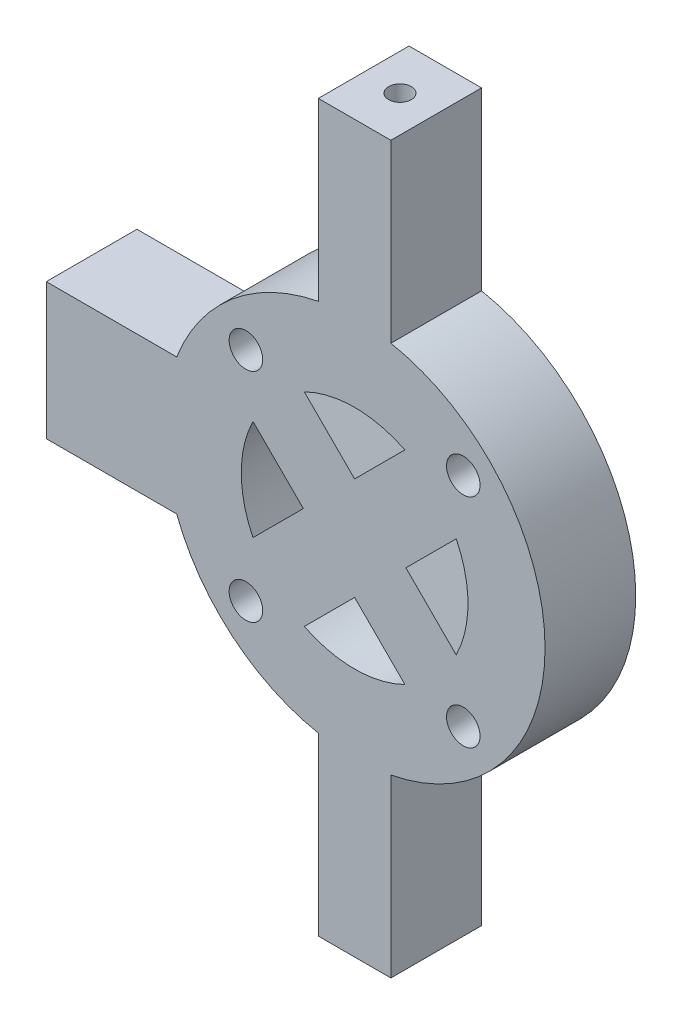
ISO-10303-21;
HEADER;
FILE_DESCRIPTION(('STEP AP214'),'2;1');
FILE_NAME('part.step','',(''),(''),'','','');
FILE_SCHEMA(('AUTOMOTIVE_DESIGN { 1 0 10303 214 1 1 1 1 }'));
ENDSEC;
DATA;
#1=APPLICATION_CONTEXT('core data for automotive mechanical design processes');
#2=APPLICATION_PROTOCOL_DEFINITION('international standard','automotive_design',2000,#1);
#3=PRODUCT_CONTEXT('',#1,'mechanical');
#4=PRODUCT('Part','Part','',(#3));
#5=PRODUCT_RELATED_PRODUCT_CATEGORY('part','',(#4));
#6=PRODUCT_DEFINITION_FORMATION('','',#4);
#7=PRODUCT_DEFINITION_CONTEXT('part definition',#1,'design');
#8=PRODUCT_DEFINITION('design','',#6,#7);
#9=PRODUCT_DEFINITION_SHAPE('','',#8);
#10=(LENGTH_UNIT() NAMED_UNIT(*) SI_UNIT(.MILLI.,.METRE.));
#11=(NAMED_UNIT(*) PLANE_ANGLE_UNIT() SI_UNIT($,.RADIAN.));
#12=(NAMED_UNIT(*) SI_UNIT($,.STERADIAN.) SOLID_ANGLE_UNIT());
#13=UNCERTAINTY_MEASURE_WITH_UNIT(LENGTH_MEASURE(1.E-05),#10,'distance_accuracy_value','');
#14=(GEOMETRIC_REPRESENTATION_CONTEXT(3) GLOBAL_UNCERTAINTY_ASSIGNED_CONTEXT((#13)) GLOBAL_UNIT_ASSIGNED_CONTEXT((#10,
#11,#12)) REPRESENTATION_CONTEXT('',''));
#15=CARTESIAN_POINT('',(0.,0.,0.));
#16=DIRECTION('',(0.,0.,1.));
#17=DIRECTION('',(1.,0.,0.));
#18=AXIS2_PLACEMENT_3D('',#15,#16,#17);
#19=CARTESIAN_POINT('',(-8.93740474267754,3.28055049318516,10.));
#20=DIRECTION('',(-0.707106781186548,-0.707106781186548,0.));
#21=DIRECTION('',(0.707106781186548,-0.707106781186548,0.));
#22=AXIS2_PLACEMENT_3D('',#19,#20,#21);
#23=PLANE('',#22);
#24=DIRECTION('',(-0.707106781186548,0.707106781186548,0.));
#25=VECTOR('',#24,1.);
#26=CARTESIAN_POINT('',(-8.93740474267754,3.28055049318516,0.));
#27=LINE('',#26,#25);
#28=CARTESIAN_POINT('',(-5.65685424949238,0.,0.));
#29=VERTEX_POINT('',#28);
#30=CARTESIAN_POINT('',(-11.2024942369683,5.54563998747593,0.));
#31=VERTEX_POINT('',#30);
#32=EDGE_CURVE('E313',#29,#31,#27,.T.);
#33=ORIENTED_EDGE('',*,*,#32,.F.);
#34=DIRECTION('',(0.,0.,-1.));
#35=VECTOR('',#34,1.);
#36=CARTESIAN_POINT('',(-5.65685424949238,0.,10.));
#37=LINE('',#36,#35);
#38=CARTESIAN_POINT('',(-5.65685424949238,0.,10.));
#39=VERTEX_POINT('',#38);
#40=EDGE_CURVE('E10',#39,#29,#37,.T.);
#41=ORIENTED_EDGE('',*,*,#40,.F.);
#42=DIRECTION('',(-0.707106781186548,0.707106781186548,0.));
#43=VECTOR('',#42,1.);
#44=CARTESIAN_POINT('',(-8.93740474267754,3.28055049318516,10.));
#45=LINE('',#44,#43);
#46=CARTESIAN_POINT('',(-11.2024942369683,5.54563998747593,10.));
#47=VERTEX_POINT('',#46);
#48=EDGE_CURVE('E497',#39,#47,#45,.T.);
#49=ORIENTED_EDGE('',*,*,#48,.T.);
#50=DIRECTION('',(0.,0.,-1.));
#51=VECTOR('',#50,1.);
#52=CARTESIAN_POINT('',(-11.2024942369683,5.54563998747593,10.));
#53=LINE('',#52,#51);
#54=EDGE_CURVE('E385',#47,#31,#53,.T.);
#55=ORIENTED_EDGE('',*,*,#54,.T.);
#56=EDGE_LOOP('',(#33,#41,#49,#55));
#57=FACE_BOUND('',#56,.T.);
#58=ADVANCED_FACE('F16',(#57),#23,.T.);
#59=CARTESIAN_POINT('',(-6.72044463876808,-1.06359038927569,10.));
#60=DIRECTION('',(0.707106781186547,-0.707106781186548,0.));
#61=DIRECTION('',(0.707106781186548,0.707106781186547,0.));
#62=AXIS2_PLACEMENT_3D('',#59,#60,#61);
#63=PLANE('',#62);
#64=DIRECTION('',(-0.707106781186548,-0.707106781186547,0.));
#65=VECTOR('',#64,1.);
#66=CARTESIAN_POINT('',(-6.72044463876808,-1.06359038927569,0.));
#67=LINE('',#66,#65);
#68=CARTESIAN_POINT('',(-11.2024942369683,-5.54563998747592,0.));
#69=VERTEX_POINT('',#68);
#70=EDGE_CURVE('E321',#29,#69,#67,.T.);
#71=ORIENTED_EDGE('',*,*,#70,.T.);
#72=DIRECTION('',(0.,0.,-1.));
#73=VECTOR('',#72,1.);
#74=CARTESIAN_POINT('',(-11.2024942369683,-5.54563998747592,10.));
#75=LINE('',#74,#73);
#76=CARTESIAN_POINT('',(-11.2024942369683,-5.54563998747592,10.));
#77=VERTEX_POINT('',#76);
#78=EDGE_CURVE('E27',#77,#69,#75,.T.);
#79=ORIENTED_EDGE('',*,*,#78,.F.);
#80=DIRECTION('',(-0.707106781186548,-0.707106781186547,0.));
#81=VECTOR('',#80,1.);
#82=CARTESIAN_POINT('',(-6.72044463876808,-1.06359038927569,10.));
#83=LINE('',#82,#81);
#84=EDGE_CURVE('E499',#39,#77,#83,.T.);
#85=ORIENTED_EDGE('',*,*,#84,.F.);
#86=ORIENTED_EDGE('',*,*,#40,.T.);
#87=EDGE_LOOP('',(#71,#79,#85,#86));
#88=FACE_BOUND('',#87,.T.);
#89=ADVANCED_FACE('F544',(#88),#63,.F.);
#90=CARTESIAN_POINT('',(5.54563998747593,-11.2024942369683,0.));
#91=VERTEX_POINT('',#90);
#92=CARTESIAN_POINT('',(0.,-5.65685424949237,0.));
#93=VERTEX_POINT('',#92);
#94=EDGE_CURVE('E314',#91,#93,#27,.T.);
#95=ORIENTED_EDGE('',*,*,#94,.F.);
#96=DIRECTION('',(0.,0.,-1.));
#97=VECTOR('',#96,1.);
#98=CARTESIAN_POINT('',(5.54563998747593,-11.2024942369683,10.));
#99=LINE('',#98,#97);
#100=CARTESIAN_POINT('',(5.54563998747593,-11.2024942369683,10.));
#101=VERTEX_POINT('',#100);
#102=EDGE_CURVE('E387',#101,#91,#99,.T.);
#103=ORIENTED_EDGE('',*,*,#102,.F.);
#104=CARTESIAN_POINT('',(0.,-5.65685424949237,10.));
#105=VERTEX_POINT('',#104);
#106=EDGE_CURVE('E477',#101,#105,#45,.T.);
#107=ORIENTED_EDGE('',*,*,#106,.T.);
#108=DIRECTION('',(0.,0.,-1.));
#109=VECTOR('',#108,1.);
#110=CARTESIAN_POINT('',(0.,-5.65685424949237,10.));
#111=LINE('',#110,#109);
#112=EDGE_CURVE('E394',#105,#93,#111,.T.);
#113=ORIENTED_EDGE('',*,*,#112,.T.);
#114=EDGE_LOOP('',(#95,#103,#107,#113));
#115=FACE_BOUND('',#114,.T.);
#116=ADVANCED_FACE('F547',(#115),#23,.T.);
#117=CARTESIAN_POINT('',(0.,0.,10.));
#118=DIRECTION('',(0.,0.,-1.));
#119=DIRECTION('',(-1.,0.,0.));
#120=AXIS2_PLACEMENT_3D('',#117,#118,#119);
#121=CYLINDRICAL_SURFACE('',#120,12.5);
#122=CARTESIAN_POINT('',(0.,0.,0.));
#123=DIRECTION('',(0.,0.,1.));
#124=DIRECTION('',(1.,0.,0.));
#125=AXIS2_PLACEMENT_3D('',#122,#123,#124);
#126=CIRCLE('',#125,12.5);
#127=CARTESIAN_POINT('',(-5.54563998747593,-11.2024942369683,0.));
#128=VERTEX_POINT('',#127);
#129=EDGE_CURVE('E303',#128,#91,#126,.T.);
#130=ORIENTED_EDGE('',*,*,#129,.F.);
#131=DIRECTION('',(0.,0.,-1.));
#132=VECTOR('',#131,1.);
#133=CARTESIAN_POINT('',(-5.54563998747593,-11.2024942369683,10.));
#134=LINE('',#133,#132);
#135=CARTESIAN_POINT('',(-5.54563998747593,-11.2024942369683,10.));
#136=VERTEX_POINT('',#135);
#137=EDGE_CURVE('E397',#136,#128,#134,.T.);
#138=ORIENTED_EDGE('',*,*,#137,.F.);
#139=CARTESIAN_POINT('',(0.,0.,10.));
#140=DIRECTION('',(0.,0.,1.));
#141=DIRECTION('',(1.,0.,0.));
#142=AXIS2_PLACEMENT_3D('',#139,#140,#141);
#143=CIRCLE('',#142,12.5);
#144=EDGE_CURVE('E472',#136,#101,#143,.T.);
#145=ORIENTED_EDGE('',*,*,#144,.T.);
#146=ORIENTED_EDGE('',*,*,#102,.T.);
#147=EDGE_LOOP('',(#130,#138,#145,#146));
#148=FACE_BOUND('',#147,.T.);
#149=ADVANCED_FACE('F556',(#148),#121,.F.);
#150=CARTESIAN_POINT('',(0.707106781186543,-4.94974746830583,10.));
#151=DIRECTION('',(0.707106781186547,-0.707106781186548,0.));
#152=DIRECTION('',(0.707106781186548,0.707106781186547,0.));
#153=AXIS2_PLACEMENT_3D('',#150,#151,#152);
#154=PLANE('',#153);
#155=DIRECTION('',(-0.707106781186548,-0.707106781186547,0.));
#156=VECTOR('',#155,1.);
#157=CARTESIAN_POINT('',(0.707106781186543,-4.94974746830583,0.));
#158=LINE('',#157,#156);
#159=CARTESIAN_POINT('',(11.2024942369683,5.54563998747592,0.));
#160=VERTEX_POINT('',#159);
#161=CARTESIAN_POINT('',(5.65685424949238,0.,0.));
#162=VERTEX_POINT('',#161);
#163=EDGE_CURVE('E326',#160,#162,#158,.T.);
#164=ORIENTED_EDGE('',*,*,#163,.F.);
#165=DIRECTION('',(0.,0.,-1.));
#166=VECTOR('',#165,1.);
#167=CARTESIAN_POINT('',(11.2024942369683,5.54563998747592,10.));
#168=LINE('',#167,#166);
#169=CARTESIAN_POINT('',(11.2024942369683,5.54563998747592,10.));
#170=VERTEX_POINT('',#169);
#171=EDGE_CURVE('E398',#170,#160,#168,.T.);
#172=ORIENTED_EDGE('',*,*,#171,.F.);
#173=DIRECTION('',(-0.707106781186548,-0.707106781186547,0.));
#174=VECTOR('',#173,1.);
#175=CARTESIAN_POINT('',(0.707106781186543,-4.94974746830583,10.));
#176=LINE('',#175,#174);
#177=CARTESIAN_POINT('',(5.65685424949238,0.,10.));
#178=VERTEX_POINT('',#177);
#179=EDGE_CURVE('E502',#170,#178,#176,.T.);
#180=ORIENTED_EDGE('',*,*,#179,.T.);
#181=DIRECTION('',(0.,0.,-1.));
#182=VECTOR('',#181,1.);
#183=CARTESIAN_POINT('',(5.65685424949238,0.,10.));
#184=LINE('',#183,#182);
#185=EDGE_CURVE('E399',#178,#162,#184,.T.);
#186=ORIENTED_EDGE('',*,*,#185,.T.);
#187=EDGE_LOOP('',(#164,#172,#180,#186));
#188=FACE_BOUND('',#187,.T.);
#189=ADVANCED_FACE('F561',(#188),#154,.T.);
#190=CARTESIAN_POINT('',(11.2024942369683,-5.54563998747592,0.));
#191=VERTEX_POINT('',#190);
#192=EDGE_CURVE('E320',#191,#160,#126,.T.);
#193=ORIENTED_EDGE('',*,*,#192,.F.);
#194=DIRECTION('',(0.,0.,-1.));
#195=VECTOR('',#194,1.);
#196=CARTESIAN_POINT('',(11.2024942369683,-5.54563998747592,10.));
#197=LINE('',#196,#195);
#198=CARTESIAN_POINT('',(11.2024942369683,-5.54563998747592,10.));
#199=VERTEX_POINT('',#198);
#200=EDGE_CURVE('E402',#199,#191,#197,.T.);
#201=ORIENTED_EDGE('',*,*,#200,.F.);
#202=EDGE_CURVE('E484',#199,#170,#143,.T.);
#203=ORIENTED_EDGE('',*,*,#202,.T.);
#204=ORIENTED_EDGE('',*,*,#171,.T.);
#205=EDGE_LOOP('',(#193,#201,#203,#204));
#206=FACE_BOUND('',#205,.T.);
#207=ADVANCED_FACE('F564',(#206),#121,.F.);
#208=CARTESIAN_POINT('',(2.82842712474619,2.82842712474619,10.));
#209=DIRECTION('',(-0.707106781186548,-0.707106781186548,0.));
#210=DIRECTION('',(0.707106781186548,-0.707106781186548,0.));
#211=AXIS2_PLACEMENT_3D('',#208,#209,#210);
#212=PLANE('',#211);
#213=DIRECTION('',(-0.707106781186548,0.707106781186548,0.));
#214=VECTOR('',#213,1.);
#215=CARTESIAN_POINT('',(2.82842712474619,2.82842712474619,0.));
#216=LINE('',#215,#214);
#217=CARTESIAN_POINT('',(0.,5.65685424949238,0.));
#218=VERTEX_POINT('',#217);
#219=CARTESIAN_POINT('',(-5.54563998747592,11.2024942369683,0.));
#220=VERTEX_POINT('',#219);
#221=EDGE_CURVE('E309',#218,#220,#216,.T.);
#222=ORIENTED_EDGE('',*,*,#221,.T.);
#223=DIRECTION('',(0.,0.,-1.));
#224=VECTOR('',#223,1.);
#225=CARTESIAN_POINT('',(-5.54563998747592,11.2024942369683,10.));
#226=LINE('',#225,#224);
#227=CARTESIAN_POINT('',(-5.54563998747592,11.2024942369683,10.));
#228=VERTEX_POINT('',#227);
#229=EDGE_CURVE('E403',#228,#220,#226,.T.);
#230=ORIENTED_EDGE('',*,*,#229,.F.);
#231=DIRECTION('',(-0.707106781186548,0.707106781186548,0.));
#232=VECTOR('',#231,1.);
#233=CARTESIAN_POINT('',(2.82842712474619,2.82842712474619,10.));
#234=LINE('',#233,#232);
#235=CARTESIAN_POINT('',(0.,5.65685424949238,10.));
#236=VERTEX_POINT('',#235);
#237=EDGE_CURVE('E479',#236,#228,#234,.T.);
#238=ORIENTED_EDGE('',*,*,#237,.F.);
#239=DIRECTION('',(0.,0.,-1.));
#240=VECTOR('',#239,1.);
#241=CARTESIAN_POINT('',(0.,5.65685424949238,10.));
#242=LINE('',#241,#240);
#243=EDGE_CURVE('E389',#236,#218,#242,.T.);
#244=ORIENTED_EDGE('',*,*,#243,.T.);
#245=EDGE_LOOP('',(#222,#230,#238,#244));
#246=FACE_BOUND('',#245,.T.);
#247=ADVANCED_FACE('F646',(#246),#212,.F.);
#248=CARTESIAN_POINT('',(5.54563998747593,11.2024942369683,0.));
#249=VERTEX_POINT('',#248);
#250=EDGE_CURVE('E315',#249,#220,#126,.T.);
#251=ORIENTED_EDGE('',*,*,#250,.F.);
#252=DIRECTION('',(0.,0.,-1.));
#253=VECTOR('',#252,1.);
#254=CARTESIAN_POINT('',(5.54563998747593,11.2024942369683,10.));
#255=LINE('',#254,#253);
#256=CARTESIAN_POINT('',(5.54563998747593,11.2024942369683,10.));
#257=VERTEX_POINT('',#256);
#258=EDGE_CURVE('E393',#257,#249,#255,.T.);
#259=ORIENTED_EDGE('',*,*,#258,.F.);
#260=EDGE_CURVE('E488',#257,#228,#143,.T.);
#261=ORIENTED_EDGE('',*,*,#260,.T.);
#262=ORIENTED_EDGE('',*,*,#229,.T.);
#263=EDGE_LOOP('',(#251,#259,#261,#262));
#264=FACE_BOUND('',#263,.T.);
#265=ADVANCED_FACE('F628',(#264),#121,.F.);
#266=CARTESIAN_POINT('',(4.72146990150213,40.,10.));
#267=DIRECTION('',(0.,1.,0.));
#268=DIRECTION('',(0.,0.,1.));
#269=AXIS2_PLACEMENT_3D('',#266,#267,#268);
#270=PLANE('',#269);
#271=CARTESIAN_POINT('',(0.,40.,5.));
#272=DIRECTION('',(0.,1.,0.));
#273=DIRECTION('',(-1.,0.,0.));
#274=AXIS2_PLACEMENT_3D('',#271,#272,#273);
#275=CIRCLE('',#274,1.25);
#276=CARTESIAN_POINT('',(-1.25,40.,5.));
#277=VERTEX_POINT('',#276);
#278=EDGE_CURVE('E827',#277,#277,#275,.T.);
#279=ORIENTED_EDGE('',*,*,#278,.F.);
#280=EDGE_LOOP('',(#279));
#281=FACE_BOUND('',#280,.T.);
#282=DIRECTION('',(1.,0.,0.));
#283=VECTOR('',#282,1.);
#284=CARTESIAN_POINT('',(4.72146990150213,40.,0.));
#285=LINE('',#284,#283);
#286=CARTESIAN_POINT('',(-4.,40.,0.));
#287=VERTEX_POINT('',#286);
#288=CARTESIAN_POINT('',(4.,40.,0.));
#289=VERTEX_POINT('',#288);
#290=EDGE_CURVE('E289',#287,#289,#285,.T.);
#291=ORIENTED_EDGE('',*,*,#290,.F.);
#292=DIRECTION('',(0.,0.,-1.));
#293=VECTOR('',#292,1.);
#294=CARTESIAN_POINT('',(-4.,40.,10.));
#295=LINE('',#294,#293);
#296=CARTESIAN_POINT('',(-4.,40.,10.));
#297=VERTEX_POINT('',#296);
#298=EDGE_CURVE('E20',#297,#287,#295,.T.);
#299=ORIENTED_EDGE('',*,*,#298,.F.);
#300=DIRECTION('',(1.,0.,0.));
#301=VECTOR('',#300,1.);
#302=CARTESIAN_POINT('',(4.72146990150213,40.,10.));
#303=LINE('',#302,#301);
#304=CARTESIAN_POINT('',(4.,40.,10.));
#305=VERTEX_POINT('',#304);
#306=EDGE_CURVE('E351',#297,#305,#303,.T.);
#307=ORIENTED_EDGE('',*,*,#306,.T.);
#308=DIRECTION('',(0.,0.,-1.));
#309=VECTOR('',#308,1.);
#310=CARTESIAN_POINT('',(4.,40.,10.));
#311=LINE('',#310,#309);
#312=EDGE_CURVE('E422',#305,#289,#311,.T.);
#313=ORIENTED_EDGE('',*,*,#312,.T.);
#314=EDGE_LOOP('',(#291,#299,#307,#313));
#315=FACE_BOUND('',#314,.T.);
#316=ADVANCED_FACE('F18',(#281,#315),#270,.T.);
#317=CARTESIAN_POINT('',(-4.,47.1123982965946,10.));
#318=DIRECTION('',(1.,0.,0.));
#319=DIRECTION('',(0.,1.,0.));
#320=AXIS2_PLACEMENT_3D('',#317,#318,#319);
#321=PLANE('',#320);
#322=DIRECTION('',(0.,-1.,0.));
#323=VECTOR('',#322,1.);
#324=CARTESIAN_POINT('',(-4.,47.1123982965946,0.));
#325=LINE('',#324,#323);
#326=CARTESIAN_POINT('',(-4.,20.6155281280883,0.));
#327=VERTEX_POINT('',#326);
#328=EDGE_CURVE('E293',#287,#327,#325,.T.);
#329=ORIENTED_EDGE('',*,*,#328,.T.);
#330=DIRECTION('',(0.,0.,-1.));
#331=VECTOR('',#330,1.);
#332=CARTESIAN_POINT('',(-4.,20.6155281280883,10.));
#333=LINE('',#332,#331);
#334=CARTESIAN_POINT('',(-4.,20.6155281280883,10.));
#335=VERTEX_POINT('',#334);
#336=EDGE_CURVE('E376',#335,#327,#333,.T.);
#337=ORIENTED_EDGE('',*,*,#336,.F.);
#338=DIRECTION('',(0.,-1.,0.));
#339=VECTOR('',#338,1.);
#340=CARTESIAN_POINT('',(-4.,47.1123982965946,10.));
#341=LINE('',#340,#339);
#342=EDGE_CURVE('E438',#297,#335,#341,.T.);
#343=ORIENTED_EDGE('',*,*,#342,.F.);
#344=ORIENTED_EDGE('',*,*,#298,.T.);
#345=EDGE_LOOP('',(#329,#337,#343,#344));
#346=FACE_BOUND('',#345,.T.);
#347=ADVANCED_FACE('F437',(#346),#321,.F.);
#348=CARTESIAN_POINT('',(0.,0.,10.));
#349=DIRECTION('',(0.,0.,-1.));
#350=DIRECTION('',(-1.,0.,0.));
#351=AXIS2_PLACEMENT_3D('',#348,#349,#350);
#352=CYLINDRICAL_SURFACE('',#351,21.);
#353=CARTESIAN_POINT('',(0.,0.,0.));
#354=DIRECTION('',(0.,0.,1.));
#355=DIRECTION('',(1.,0.,0.));
#356=AXIS2_PLACEMENT_3D('',#353,#354,#355);
#357=CIRCLE('',#356,21.);
#358=CARTESIAN_POINT('',(-19.6150452459331,7.5,0.));
#359=VERTEX_POINT('',#358);
#360=EDGE_CURVE('E305',#327,#359,#357,.T.);
#361=ORIENTED_EDGE('',*,*,#360,.T.);
#362=DIRECTION('',(0.,0.,-1.));
#363=VECTOR('',#362,1.);
#364=CARTESIAN_POINT('',(-19.6150452459331,7.5,10.));
#365=LINE('',#364,#363);
#366=CARTESIAN_POINT('',(-19.6150452459331,7.5,10.));
#367=VERTEX_POINT('',#366);
#368=EDGE_CURVE('E250',#367,#359,#365,.T.);
#369=ORIENTED_EDGE('',*,*,#368,.F.);
#370=CARTESIAN_POINT('',(0.,0.,10.));
#371=DIRECTION('',(0.,0.,1.));
#372=DIRECTION('',(1.,0.,0.));
#373=AXIS2_PLACEMENT_3D('',#370,#371,#372);
#374=CIRCLE('',#373,21.);
#375=EDGE_CURVE('E259',#335,#367,#374,.T.);
#376=ORIENTED_EDGE('',*,*,#375,.F.);
#377=ORIENTED_EDGE('',*,*,#336,.T.);
#378=EDGE_LOOP('',(#361,#369,#376,#377));
#379=FACE_BOUND('',#378,.T.);
#380=ADVANCED_FACE('F458',(#379),#352,.T.);
#381=CARTESIAN_POINT('',(-28.7363744676113,7.5,10.));
#382=DIRECTION('',(0.,1.,0.));
#383=DIRECTION('',(0.,0.,1.));
#384=AXIS2_PLACEMENT_3D('',#381,#382,#383);
#385=PLANE('',#384);
#386=DIRECTION('',(1.,0.,0.));
#387=VECTOR('',#386,1.);
#388=CARTESIAN_POINT('',(-28.7363744676113,7.5,0.));
#389=LINE('',#388,#387);
#390=CARTESIAN_POINT('',(-34.,7.5,0.));
#391=VERTEX_POINT('',#390);
#392=EDGE_CURVE('E244',#391,#359,#389,.T.);
#393=ORIENTED_EDGE('',*,*,#392,.F.);
#394=DIRECTION('',(0.,0.,-1.));
#395=VECTOR('',#394,1.);
#396=CARTESIAN_POINT('',(-34.,7.5,10.));
#397=LINE('',#396,#395);
#398=CARTESIAN_POINT('',(-34.,7.5,10.));
#399=VERTEX_POINT('',#398);
#400=EDGE_CURVE('E239',#399,#391,#397,.T.);
#401=ORIENTED_EDGE('',*,*,#400,.F.);
#402=DIRECTION('',(1.,0.,0.));
#403=VECTOR('',#402,1.);
#404=CARTESIAN_POINT('',(-28.7363744676113,7.5,10.));
#405=LINE('',#404,#403);
#406=EDGE_CURVE('E242',#399,#367,#405,.T.);
#407=ORIENTED_EDGE('',*,*,#406,.T.);
#408=ORIENTED_EDGE('',*,*,#368,.T.);
#409=EDGE_LOOP('',(#393,#401,#407,#408));
#410=FACE_BOUND('',#409,.T.);
#411=ADVANCED_FACE('F241',(#410),#385,.T.);
#412=CARTESIAN_POINT('',(-34.,1.27073500305414,10.));
#413=DIRECTION('',(-1.,0.,0.));
#414=DIRECTION('',(0.,-1.,0.));
#415=AXIS2_PLACEMENT_3D('',#412,#413,#414);
#416=PLANE('',#415);
#417=DIRECTION('',(0.,1.,0.));
#418=VECTOR('',#417,1.);
#419=CARTESIAN_POINT('',(-34.,1.27073500305414,0.));
#420=LINE('',#419,#418);
#421=CARTESIAN_POINT('',(-34.,-7.5,0.));
#422=VERTEX_POINT('',#421);
#423=EDGE_CURVE('E355',#422,#391,#420,.T.);
#424=ORIENTED_EDGE('',*,*,#423,.F.);
#425=DIRECTION('',(0.,0.,-1.));
#426=VECTOR('',#425,1.);
#427=CARTESIAN_POINT('',(-34.,-7.5,10.));
#428=LINE('',#427,#426);
#429=CARTESIAN_POINT('',(-34.,-7.5,10.));
#430=VERTEX_POINT('',#429);
#431=EDGE_CURVE('E251',#430,#422,#428,.T.);
#432=ORIENTED_EDGE('',*,*,#431,.F.);
#433=DIRECTION('',(0.,1.,0.));
#434=VECTOR('',#433,1.);
#435=CARTESIAN_POINT('',(-34.,1.27073500305414,10.));
#436=LINE('',#435,#434);
#437=EDGE_CURVE('E257',#430,#399,#436,.T.);
#438=ORIENTED_EDGE('',*,*,#437,.T.);
#439=ORIENTED_EDGE('',*,*,#400,.T.);
#440=EDGE_LOOP('',(#424,#432,#438,#439));
#441=FACE_BOUND('',#440,.T.);
#442=ADVANCED_FACE('F265',(#441),#416,.T.);
#443=CARTESIAN_POINT('',(-23.7363744676113,-7.5,10.));
#444=DIRECTION('',(0.,1.,0.));
#445=DIRECTION('',(0.,0.,1.));
#446=AXIS2_PLACEMENT_3D('',#443,#444,#445);
#447=PLANE('',#446);
#448=CARTESIAN_POINT('',(-28.,-7.5,5.));
#449=DIRECTION('',(0.,-1.,0.));
#450=DIRECTION('',(1.,0.,0.));
#451=AXIS2_PLACEMENT_3D('',#448,#449,#450);
#452=CIRCLE('',#451,1.25);
#453=CARTESIAN_POINT('',(-26.75,-7.5,5.));
#454=VERTEX_POINT('',#453);
#455=EDGE_CURVE('E855',#454,#454,#452,.T.);
#456=ORIENTED_EDGE('',*,*,#455,.F.);
#457=EDGE_LOOP('',(#456));
#458=FACE_BOUND('',#457,.T.);
#459=DIRECTION('',(1.,0.,0.));
#460=VECTOR('',#459,1.);
#461=CARTESIAN_POINT('',(-23.7363744676113,-7.5,0.));
#462=LINE('',#461,#460);
#463=CARTESIAN_POINT('',(-19.6150452459331,-7.5,0.));
#464=VERTEX_POINT('',#463);
#465=EDGE_CURVE('E357',#422,#464,#462,.T.);
#466=ORIENTED_EDGE('',*,*,#465,.T.);
#467=DIRECTION('',(0.,0.,-1.));
#468=VECTOR('',#467,1.);
#469=CARTESIAN_POINT('',(-19.6150452459331,-7.5,10.));
#470=LINE('',#469,#468);
#471=CARTESIAN_POINT('',(-19.6150452459331,-7.5,10.));
#472=VERTEX_POINT('',#471);
#473=EDGE_CURVE('E377',#472,#464,#470,.T.);
#474=ORIENTED_EDGE('',*,*,#473,.F.);
#475=DIRECTION('',(1.,0.,0.));
#476=VECTOR('',#475,1.);
#477=CARTESIAN_POINT('',(-23.7363744676113,-7.5,10.));
#478=LINE('',#477,#476);
#479=EDGE_CURVE('E263',#430,#472,#478,.T.);
#480=ORIENTED_EDGE('',*,*,#479,.F.);
#481=ORIENTED_EDGE('',*,*,#431,.T.);
#482=EDGE_LOOP('',(#466,#474,#480,#481));
#483=FACE_BOUND('',#482,.T.);
#484=ADVANCED_FACE('F463',(#458,#483),#447,.F.);
#485=CARTESIAN_POINT('',(-4.,-20.6155281280883,0.));
#486=VERTEX_POINT('',#485);
#487=EDGE_CURVE('E298',#464,#486,#357,.T.);
#488=ORIENTED_EDGE('',*,*,#487,.T.);
#489=DIRECTION('',(0.,0.,-1.));
#490=VECTOR('',#489,1.);
#491=CARTESIAN_POINT('',(-4.,-20.6155281280883,10.));
#492=LINE('',#491,#490);
#493=CARTESIAN_POINT('',(-4.,-20.6155281280883,10.));
#494=VERTEX_POINT('',#493);
#495=EDGE_CURVE('E372',#494,#486,#492,.T.);
#496=ORIENTED_EDGE('',*,*,#495,.F.);
#497=EDGE_CURVE('E468',#472,#494,#374,.T.);
#498=ORIENTED_EDGE('',*,*,#497,.F.);
#499=ORIENTED_EDGE('',*,*,#473,.T.);
#500=EDGE_LOOP('',(#488,#496,#498,#499));
#501=FACE_BOUND('',#500,.T.);
#502=ADVANCED_FACE('F466',(#501),#352,.T.);
#503=CARTESIAN_POINT('',(-4.,-37.9101761008225,10.));
#504=DIRECTION('',(-1.,0.,0.));
#505=DIRECTION('',(0.,-1.,0.));
#506=AXIS2_PLACEMENT_3D('',#503,#504,#505);
#507=PLANE('',#506);
#508=DIRECTION('',(0.,1.,0.));
#509=VECTOR('',#508,1.);
#510=CARTESIAN_POINT('',(-4.,-37.9101761008225,0.));
#511=LINE('',#510,#509);
#512=CARTESIAN_POINT('',(-4.,-40.,0.));
#513=VERTEX_POINT('',#512);
#514=EDGE_CURVE('E343',#513,#486,#511,.T.);
#515=ORIENTED_EDGE('',*,*,#514,.F.);
#516=DIRECTION('',(0.,0.,-1.));
#517=VECTOR('',#516,1.);
#518=CARTESIAN_POINT('',(-4.,-40.,10.));
#519=LINE('',#518,#517);
#520=CARTESIAN_POINT('',(-4.,-40.,10.));
#521=VERTEX_POINT('',#520);
#522=EDGE_CURVE('E141',#521,#513,#519,.T.);
#523=ORIENTED_EDGE('',*,*,#522,.F.);
#524=DIRECTION('',(0.,1.,0.));
#525=VECTOR('',#524,1.);
#526=CARTESIAN_POINT('',(-4.,-37.9101761008225,10.));
#527=LINE('',#526,#525);
#528=EDGE_CURVE('E285',#521,#494,#527,.T.);
#529=ORIENTED_EDGE('',*,*,#528,.T.);
#530=ORIENTED_EDGE('',*,*,#495,.T.);
#531=EDGE_LOOP('',(#515,#523,#529,#530));
#532=FACE_BOUND('',#531,.T.);
#533=ADVANCED_FACE('F541',(#532),#507,.T.);
#534=CARTESIAN_POINT('',(-1.71504698693752,-40.,10.));
#535=DIRECTION('',(0.,1.,0.));
#536=DIRECTION('',(0.,0.,1.));
#537=AXIS2_PLACEMENT_3D('',#534,#535,#536);
#538=PLANE('',#537);
#539=CARTESIAN_POINT('',(0.,-40.,5.));
#540=DIRECTION('',(0.,-1.,0.));
#541=DIRECTION('',(1.,0.,0.));
#542=AXIS2_PLACEMENT_3D('',#539,#540,#541);
#543=CIRCLE('',#542,1.25);
#544=CARTESIAN_POINT('',(1.25,-40.,5.));
#545=VERTEX_POINT('',#544);
#546=EDGE_CURVE('E803',#545,#545,#543,.T.);
#547=ORIENTED_EDGE('',*,*,#546,.F.);
#548=EDGE_LOOP('',(#547));
#549=FACE_BOUND('',#548,.T.);
#550=DIRECTION('',(1.,0.,0.));
#551=VECTOR('',#550,1.);
#552=CARTESIAN_POINT('',(-1.71504698693752,-40.,0.));
#553=LINE('',#552,#551);
#554=CARTESIAN_POINT('',(4.,-40.,0.));
#555=VERTEX_POINT('',#554);
#556=EDGE_CURVE('E145',#513,#555,#553,.T.);
#557=ORIENTED_EDGE('',*,*,#556,.T.);
#558=DIRECTION('',(0.,0.,-1.));
#559=VECTOR('',#558,1.);
#560=CARTESIAN_POINT('',(4.,-40.,10.));
#561=LINE('',#560,#559);
#562=CARTESIAN_POINT('',(4.,-40.,10.));
#563=VERTEX_POINT('',#562);
#564=EDGE_CURVE('E367',#563,#555,#561,.T.);
#565=ORIENTED_EDGE('',*,*,#564,.F.);
#566=DIRECTION('',(1.,0.,0.));
#567=VECTOR('',#566,1.);
#568=CARTESIAN_POINT('',(-1.71504698693752,-40.,10.));
#569=LINE('',#568,#567);
#570=EDGE_CURVE('E41',#521,#563,#569,.T.);
#571=ORIENTED_EDGE('',*,*,#570,.F.);
#572=ORIENTED_EDGE('',*,*,#522,.T.);
#573=EDGE_LOOP('',(#557,#565,#571,#572));
#574=FACE_BOUND('',#573,.T.);
#575=ADVANCED_FACE('F536',(#549,#574),#538,.F.);
#576=CARTESIAN_POINT('',(4.,-37.9101761008225,10.));
#577=DIRECTION('',(-1.,0.,0.));
#578=DIRECTION('',(0.,-1.,0.));
#579=AXIS2_PLACEMENT_3D('',#576,#577,#578);
#580=PLANE('',#579);
#581=DIRECTION('',(0.,1.,0.));
#582=VECTOR('',#581,1.);
#583=CARTESIAN_POINT('',(4.,-37.9101761008225,0.));
#584=LINE('',#583,#582);
#585=CARTESIAN_POINT('',(4.,-20.6155281280883,0.));
#586=VERTEX_POINT('',#585);
#587=EDGE_CURVE('E348',#555,#586,#584,.T.);
#588=ORIENTED_EDGE('',*,*,#587,.T.);
#589=DIRECTION('',(0.,0.,-1.));
#590=VECTOR('',#589,1.);
#591=CARTESIAN_POINT('',(4.,-20.6155281280883,10.));
#592=LINE('',#591,#590);
#593=CARTESIAN_POINT('',(4.,-20.6155281280883,10.));
#594=VERTEX_POINT('',#593);
#595=EDGE_CURVE('E370',#594,#586,#592,.T.);
#596=ORIENTED_EDGE('',*,*,#595,.F.);
#597=DIRECTION('',(0.,1.,0.));
#598=VECTOR('',#597,1.);
#599=CARTESIAN_POINT('',(4.,-37.9101761008225,10.));
#600=LINE('',#599,#598);
#601=EDGE_CURVE('E288',#563,#594,#600,.T.);
#602=ORIENTED_EDGE('',*,*,#601,.F.);
#603=ORIENTED_EDGE('',*,*,#564,.T.);
#604=EDGE_LOOP('',(#588,#596,#602,#603));
#605=FACE_BOUND('',#604,.T.);
#606=ADVANCED_FACE('F523',(#605),#580,.F.);
#607=CARTESIAN_POINT('',(4.,20.6155281280883,0.));
#608=VERTEX_POINT('',#607);
#609=EDGE_CURVE('E304',#586,#608,#357,.T.);
#610=ORIENTED_EDGE('',*,*,#609,.T.);
#611=DIRECTION('',(0.,0.,-1.));
#612=VECTOR('',#611,1.);
#613=CARTESIAN_POINT('',(4.,20.6155281280883,10.));
#614=LINE('',#613,#612);
#615=CARTESIAN_POINT('',(4.,20.6155281280883,10.));
#616=VERTEX_POINT('',#615);
#617=EDGE_CURVE('E411',#616,#608,#614,.T.);
#618=ORIENTED_EDGE('',*,*,#617,.F.);
#619=EDGE_CURVE('E474',#594,#616,#374,.T.);
#620=ORIENTED_EDGE('',*,*,#619,.F.);
#621=ORIENTED_EDGE('',*,*,#595,.T.);
#622=EDGE_LOOP('',(#610,#618,#620,#621));
#623=FACE_BOUND('',#622,.T.);
#624=ADVANCED_FACE('F524',(#623),#352,.T.);
#625=CARTESIAN_POINT('',(-11.985459941112,-11.985459941112,10.));
#626=DIRECTION('',(0.,0.,-1.));
#627=DIRECTION('',(-1.,0.,0.));
#628=AXIS2_PLACEMENT_3D('',#625,#626,#627);
#629=CYLINDRICAL_SURFACE('',#628,1.85);
#630=CARTESIAN_POINT('',(-11.985459941112,-11.985459941112,10.));
#631=DIRECTION('',(0.,0.,1.));
#632=DIRECTION('',(1.,0.,0.));
#633=AXIS2_PLACEMENT_3D('',#630,#631,#632);
#634=CIRCLE('',#633,1.85);
#635=CARTESIAN_POINT('',(-10.135459941112,-11.985459941112,10.));
#636=VERTEX_POINT('',#635);
#637=EDGE_CURVE('E268',#636,#636,#634,.T.);
#638=ORIENTED_EDGE('',*,*,#637,.T.);
#639=EDGE_LOOP('',(#638));
#640=FACE_BOUND('',#639,.T.);
#641=CARTESIAN_POINT('',(-11.985459941112,-11.985459941112,0.));
#642=DIRECTION('',(0.,0.,1.));
#643=DIRECTION('',(1.,0.,0.));
#644=AXIS2_PLACEMENT_3D('',#641,#642,#643);
#645=CIRCLE('',#644,1.85);
#646=CARTESIAN_POINT('',(-10.135459941112,-11.985459941112,0.));
#647=VERTEX_POINT('',#646);
#648=EDGE_CURVE('E335',#647,#647,#645,.T.);
#649=ORIENTED_EDGE('',*,*,#648,.F.);
#650=EDGE_LOOP('',(#649));
#651=FACE_BOUND('',#650,.T.);
#652=ADVANCED_FACE('F526',(#640,#651),#629,.F.);
#653=EDGE_CURVE('E319',#31,#69,#126,.T.);
#654=ORIENTED_EDGE('',*,*,#653,.F.);
#655=ORIENTED_EDGE('',*,*,#54,.F.);
#656=EDGE_CURVE('E262',#47,#77,#143,.T.);
#657=ORIENTED_EDGE('',*,*,#656,.T.);
#658=ORIENTED_EDGE('',*,*,#78,.T.);
#659=EDGE_LOOP('',(#654,#655,#657,#658));
#660=FACE_BOUND('',#659,.T.);
#661=ADVANCED_FACE('F533',(#660),#121,.F.);
#662=CARTESIAN_POINT('',(11.985459941112,-11.985459941112,10.));
#663=DIRECTION('',(0.,0.,-1.));
#664=DIRECTION('',(-1.,0.,0.));
#665=AXIS2_PLACEMENT_3D('',#662,#663,#664);
#666=CYLINDRICAL_SURFACE('',#665,1.85);
#667=CARTESIAN_POINT('',(11.985459941112,-11.985459941112,10.));
#668=DIRECTION('',(0.,0.,1.));
#669=DIRECTION('',(1.,0.,0.));
#670=AXIS2_PLACEMENT_3D('',#667,#668,#669);
#671=CIRCLE('',#670,1.85);
#672=CARTESIAN_POINT('',(13.835459941112,-11.985459941112,10.));
#673=VERTEX_POINT('',#672);
#674=EDGE_CURVE('E482',#673,#673,#671,.T.);
#675=ORIENTED_EDGE('',*,*,#674,.T.);
#676=EDGE_LOOP('',(#675));
#677=FACE_BOUND('',#676,.T.);
#678=CARTESIAN_POINT('',(11.985459941112,-11.985459941112,0.));
#679=DIRECTION('',(0.,0.,1.));
#680=DIRECTION('',(1.,0.,0.));
#681=AXIS2_PLACEMENT_3D('',#678,#679,#680);
#682=CIRCLE('',#681,1.85);
#683=CARTESIAN_POINT('',(13.835459941112,-11.985459941112,0.));
#684=VERTEX_POINT('',#683);
#685=EDGE_CURVE('E339',#684,#684,#682,.T.);
#686=ORIENTED_EDGE('',*,*,#685,.F.);
#687=EDGE_LOOP('',(#686));
#688=FACE_BOUND('',#687,.T.);
#689=ADVANCED_FACE('F627',(#677,#688),#666,.F.);
#690=EDGE_CURVE('E325',#93,#128,#158,.T.);
#691=ORIENTED_EDGE('',*,*,#690,.F.);
#692=ORIENTED_EDGE('',*,*,#112,.F.);
#693=EDGE_CURVE('E277',#105,#136,#176,.T.);
#694=ORIENTED_EDGE('',*,*,#693,.T.);
#695=ORIENTED_EDGE('',*,*,#137,.T.);
#696=EDGE_LOOP('',(#691,#692,#694,#695));
#697=FACE_BOUND('',#696,.T.);
#698=ADVANCED_FACE('F636',(#697),#154,.T.);
#699=EDGE_CURVE('E302',#191,#162,#216,.T.);
#700=ORIENTED_EDGE('',*,*,#699,.T.);
#701=ORIENTED_EDGE('',*,*,#185,.F.);
#702=EDGE_CURVE('E471',#199,#178,#234,.T.);
#703=ORIENTED_EDGE('',*,*,#702,.F.);
#704=ORIENTED_EDGE('',*,*,#200,.T.);
#705=EDGE_LOOP('',(#700,#701,#703,#704));
#706=FACE_BOUND('',#705,.T.);
#707=ADVANCED_FACE('F638',(#706),#212,.F.);
#708=CARTESIAN_POINT('',(11.985459941112,11.985459941112,10.));
#709=DIRECTION('',(0.,0.,-1.));
#710=DIRECTION('',(-1.,0.,0.));
#711=AXIS2_PLACEMENT_3D('',#708,#709,#710);
#712=CYLINDRICAL_SURFACE('',#711,1.85);
#713=CARTESIAN_POINT('',(11.985459941112,11.985459941112,10.));
#714=DIRECTION('',(0.,0.,1.));
#715=DIRECTION('',(1.,0.,0.));
#716=AXIS2_PLACEMENT_3D('',#713,#714,#715);
#717=CIRCLE('',#716,1.85);
#718=CARTESIAN_POINT('',(13.835459941112,11.985459941112,10.));
#719=VERTEX_POINT('',#718);
#720=EDGE_CURVE('E487',#719,#719,#717,.T.);
#721=ORIENTED_EDGE('',*,*,#720,.T.);
#722=EDGE_LOOP('',(#721));
#723=FACE_BOUND('',#722,.T.);
#724=CARTESIAN_POINT('',(11.985459941112,11.985459941112,0.));
#725=DIRECTION('',(0.,0.,1.));
#726=DIRECTION('',(1.,0.,0.));
#727=AXIS2_PLACEMENT_3D('',#724,#725,#726);
#728=CIRCLE('',#727,1.85);
#729=CARTESIAN_POINT('',(13.835459941112,11.985459941112,0.));
#730=VERTEX_POINT('',#729);
#731=EDGE_CURVE('E328',#730,#730,#728,.T.);
#732=ORIENTED_EDGE('',*,*,#731,.F.);
#733=EDGE_LOOP('',(#732));
#734=FACE_BOUND('',#733,.T.);
#735=ADVANCED_FACE('F644',(#723,#734),#712,.F.);
#736=EDGE_CURVE('E327',#249,#218,#67,.T.);
#737=ORIENTED_EDGE('',*,*,#736,.T.);
#738=ORIENTED_EDGE('',*,*,#243,.F.);
#739=EDGE_CURVE('E503',#257,#236,#83,.T.);
#740=ORIENTED_EDGE('',*,*,#739,.F.);
#741=ORIENTED_EDGE('',*,*,#258,.T.);
#742=EDGE_LOOP('',(#737,#738,#740,#741));
#743=FACE_BOUND('',#742,.T.);
#744=ADVANCED_FACE('F553',(#743),#63,.F.);
#745=CARTESIAN_POINT('',(4.,47.1123982965946,10.));
#746=DIRECTION('',(1.,0.,0.));
#747=DIRECTION('',(0.,1.,0.));
#748=AXIS2_PLACEMENT_3D('',#745,#746,#747);
#749=PLANE('',#748);
#750=DIRECTION('',(0.,-1.,0.));
#751=VECTOR('',#750,1.);
#752=CARTESIAN_POINT('',(4.,47.1123982965946,0.));
#753=LINE('',#752,#751);
#754=EDGE_CURVE('E297',#289,#608,#753,.T.);
#755=ORIENTED_EDGE('',*,*,#754,.F.);
#756=ORIENTED_EDGE('',*,*,#312,.F.);
#757=DIRECTION('',(0.,-1.,0.));
#758=VECTOR('',#757,1.);
#759=CARTESIAN_POINT('',(4.,47.1123982965946,10.));
#760=LINE('',#759,#758);
#761=EDGE_CURVE('E489',#305,#616,#760,.T.);
#762=ORIENTED_EDGE('',*,*,#761,.T.);
#763=ORIENTED_EDGE('',*,*,#617,.T.);
#764=EDGE_LOOP('',(#755,#756,#762,#763));
#765=FACE_BOUND('',#764,.T.);
#766=ADVANCED_FACE('F446',(#765),#749,.T.);
#767=CARTESIAN_POINT('',(-11.985459941112,11.985459941112,10.));
#768=DIRECTION('',(0.,0.,-1.));
#769=DIRECTION('',(-1.,0.,0.));
#770=AXIS2_PLACEMENT_3D('',#767,#768,#769);
#771=CYLINDRICAL_SURFACE('',#770,1.85);
#772=CARTESIAN_POINT('',(-11.985459941112,11.985459941112,10.));
#773=DIRECTION('',(0.,0.,1.));
#774=DIRECTION('',(1.,0.,0.));
#775=AXIS2_PLACEMENT_3D('',#772,#773,#774);
#776=CIRCLE('',#775,1.85);
#777=CARTESIAN_POINT('',(-10.135459941112,11.985459941112,10.));
#778=VERTEX_POINT('',#777);
#779=EDGE_CURVE('E281',#778,#778,#776,.T.);
#780=ORIENTED_EDGE('',*,*,#779,.T.);
#781=EDGE_LOOP('',(#780));
#782=FACE_BOUND('',#781,.T.);
#783=CARTESIAN_POINT('',(-11.985459941112,11.985459941112,0.));
#784=DIRECTION('',(0.,0.,1.));
#785=DIRECTION('',(1.,0.,0.));
#786=AXIS2_PLACEMENT_3D('',#783,#784,#785);
#787=CIRCLE('',#786,1.85);
#788=CARTESIAN_POINT('',(-10.135459941112,11.985459941112,0.));
#789=VERTEX_POINT('',#788);
#790=EDGE_CURVE('E347',#789,#789,#787,.T.);
#791=ORIENTED_EDGE('',*,*,#790,.F.);
#792=EDGE_LOOP('',(#791));
#793=FACE_BOUND('',#792,.T.);
#794=ADVANCED_FACE('F599',(#782,#793),#771,.F.);
#795=CARTESIAN_POINT('',(-6.5,0.,10.));
#796=DIRECTION('',(0.,0.,1.));
#797=DIRECTION('',(1.,0.,0.));
#798=AXIS2_PLACEMENT_3D('',#795,#796,#797);
#799=PLANE('',#798);
#800=ORIENTED_EDGE('',*,*,#306,.F.);
#801=ORIENTED_EDGE('',*,*,#342,.T.);
#802=ORIENTED_EDGE('',*,*,#375,.T.);
#803=ORIENTED_EDGE('',*,*,#406,.F.);
#804=ORIENTED_EDGE('',*,*,#437,.F.);
#805=ORIENTED_EDGE('',*,*,#479,.T.);
#806=ORIENTED_EDGE('',*,*,#497,.T.);
#807=ORIENTED_EDGE('',*,*,#528,.F.);
#808=ORIENTED_EDGE('',*,*,#570,.T.);
#809=ORIENTED_EDGE('',*,*,#601,.T.);
#810=ORIENTED_EDGE('',*,*,#619,.T.);
#811=ORIENTED_EDGE('',*,*,#761,.F.);
#812=EDGE_LOOP('',(#800,#801,#802,#803,#804,#805,#806,#807,#808,#809,#810,#811));
#813=FACE_BOUND('',#812,.T.);
#814=ORIENTED_EDGE('',*,*,#237,.T.);
#815=ORIENTED_EDGE('',*,*,#260,.F.);
#816=ORIENTED_EDGE('',*,*,#739,.T.);
#817=EDGE_LOOP('',(#814,#815,#816));
#818=FACE_BOUND('',#817,.T.);
#819=ORIENTED_EDGE('',*,*,#720,.F.);
#820=EDGE_LOOP('',(#819));
#821=FACE_BOUND('',#820,.T.);
#822=ORIENTED_EDGE('',*,*,#179,.F.);
#823=ORIENTED_EDGE('',*,*,#202,.F.);
#824=ORIENTED_EDGE('',*,*,#702,.T.);
#825=EDGE_LOOP('',(#822,#823,#824));
#826=FACE_BOUND('',#825,.T.);
#827=ORIENTED_EDGE('',*,*,#106,.F.);
#828=ORIENTED_EDGE('',*,*,#144,.F.);
#829=ORIENTED_EDGE('',*,*,#693,.F.);
#830=EDGE_LOOP('',(#827,#828,#829));
#831=FACE_BOUND('',#830,.T.);
#832=ORIENTED_EDGE('',*,*,#674,.F.);
#833=EDGE_LOOP('',(#832));
#834=FACE_BOUND('',#833,.T.);
#835=ORIENTED_EDGE('',*,*,#48,.F.);
#836=ORIENTED_EDGE('',*,*,#84,.T.);
#837=ORIENTED_EDGE('',*,*,#656,.F.);
#838=EDGE_LOOP('',(#835,#836,#837));
#839=FACE_BOUND('',#838,.T.);
#840=ORIENTED_EDGE('',*,*,#637,.F.);
#841=EDGE_LOOP('',(#840));
#842=FACE_BOUND('',#841,.T.);
#843=ORIENTED_EDGE('',*,*,#779,.F.);
#844=EDGE_LOOP('',(#843));
#845=FACE_BOUND('',#844,.T.);
#846=ADVANCED_FACE('F255',(#813,#818,#821,#826,#831,#834,#839,#842,#845),#799,.T.);
#847=CARTESIAN_POINT('',(-6.5,0.,0.));
#848=DIRECTION('',(0.,0.,1.));
#849=DIRECTION('',(1.,0.,0.));
#850=AXIS2_PLACEMENT_3D('',#847,#848,#849);
#851=PLANE('',#850);
#852=ORIENTED_EDGE('',*,*,#290,.T.);
#853=ORIENTED_EDGE('',*,*,#754,.T.);
#854=ORIENTED_EDGE('',*,*,#609,.F.);
#855=ORIENTED_EDGE('',*,*,#587,.F.);
#856=ORIENTED_EDGE('',*,*,#556,.F.);
#857=ORIENTED_EDGE('',*,*,#514,.T.);
#858=ORIENTED_EDGE('',*,*,#487,.F.);
#859=ORIENTED_EDGE('',*,*,#465,.F.);
#860=ORIENTED_EDGE('',*,*,#423,.T.);
#861=ORIENTED_EDGE('',*,*,#392,.T.);
#862=ORIENTED_EDGE('',*,*,#360,.F.);
#863=ORIENTED_EDGE('',*,*,#328,.F.);
#864=EDGE_LOOP('',(#852,#853,#854,#855,#856,#857,#858,#859,#860,#861,#862,#863));
#865=FACE_BOUND('',#864,.T.);
#866=ORIENTED_EDGE('',*,*,#221,.F.);
#867=ORIENTED_EDGE('',*,*,#736,.F.);
#868=ORIENTED_EDGE('',*,*,#250,.T.);
#869=EDGE_LOOP('',(#866,#867,#868));
#870=FACE_BOUND('',#869,.T.);
#871=ORIENTED_EDGE('',*,*,#731,.T.);
#872=EDGE_LOOP('',(#871));
#873=FACE_BOUND('',#872,.T.);
#874=ORIENTED_EDGE('',*,*,#163,.T.);
#875=ORIENTED_EDGE('',*,*,#699,.F.);
#876=ORIENTED_EDGE('',*,*,#192,.T.);
#877=EDGE_LOOP('',(#874,#875,#876));
#878=FACE_BOUND('',#877,.T.);
#879=ORIENTED_EDGE('',*,*,#94,.T.);
#880=ORIENTED_EDGE('',*,*,#690,.T.);
#881=ORIENTED_EDGE('',*,*,#129,.T.);
#882=EDGE_LOOP('',(#879,#880,#881));
#883=FACE_BOUND('',#882,.T.);
#884=ORIENTED_EDGE('',*,*,#685,.T.);
#885=EDGE_LOOP('',(#884));
#886=FACE_BOUND('',#885,.T.);
#887=ORIENTED_EDGE('',*,*,#32,.T.);
#888=ORIENTED_EDGE('',*,*,#653,.T.);
#889=ORIENTED_EDGE('',*,*,#70,.F.);
#890=EDGE_LOOP('',(#887,#888,#889));
#891=FACE_BOUND('',#890,.T.);
#892=ORIENTED_EDGE('',*,*,#648,.T.);
#893=EDGE_LOOP('',(#892));
#894=FACE_BOUND('',#893,.T.);
#895=ORIENTED_EDGE('',*,*,#790,.T.);
#896=EDGE_LOOP('',(#895));
#897=FACE_BOUND('',#896,.T.);
#898=ADVANCED_FACE('F440',(#865,#870,#873,#878,#883,#886,#891,#894,#897),#851,.F.);
#899=CARTESIAN_POINT('',(0.,-34.,5.));
#900=DIRECTION('',(0.,-1.,0.));
#901=DIRECTION('',(0.,0.,-1.));
#902=AXIS2_PLACEMENT_3D('',#899,#900,#901);
#903=CYLINDRICAL_SURFACE('',#902,1.25);
#904=CARTESIAN_POINT('',(0.,-34.,5.));
#905=DIRECTION('',(0.,-1.,0.));
#906=DIRECTION('',(1.,0.,0.));
#907=AXIS2_PLACEMENT_3D('',#904,#905,#906);
#908=CIRCLE('',#907,1.25);
#909=CARTESIAN_POINT('',(1.25,-34.,5.));
#910=VERTEX_POINT('',#909);
#911=EDGE_CURVE('E294',#910,#910,#908,.T.);
#912=ORIENTED_EDGE('',*,*,#911,.F.);
#913=EDGE_LOOP('',(#912));
#914=FACE_BOUND('',#913,.T.);
#915=ORIENTED_EDGE('',*,*,#546,.T.);
#916=EDGE_LOOP('',(#915));
#917=FACE_BOUND('',#916,.T.);
#918=ADVANCED_FACE('F611',(#914,#917),#903,.F.);
#919=CARTESIAN_POINT('',(0.,-34.,5.));
#920=DIRECTION('',(0.,-1.,0.));
#921=DIRECTION('',(1.,0.,0.));
#922=AXIS2_PLACEMENT_3D('',#919,#920,#921);
#923=PLANE('',#922);
#924=ORIENTED_EDGE('',*,*,#911,.T.);
#925=EDGE_LOOP('',(#924));
#926=FACE_BOUND('',#925,.T.);
#927=ADVANCED_FACE('F616',(#926),#923,.T.);
#928=CARTESIAN_POINT('',(0.,34.,5.));
#929=DIRECTION('',(0.,1.,0.));
#930=DIRECTION('',(0.,0.,1.));
#931=AXIS2_PLACEMENT_3D('',#928,#929,#930);
#932=CYLINDRICAL_SURFACE('',#931,1.25);
#933=CARTESIAN_POINT('',(0.,34.,5.));
#934=DIRECTION('',(0.,1.,0.));
#935=DIRECTION('',(-1.,0.,0.));
#936=AXIS2_PLACEMENT_3D('',#933,#934,#935);
#937=CIRCLE('',#936,1.25);
#938=CARTESIAN_POINT('',(-1.25,34.,5.));
#939=VERTEX_POINT('',#938);
#940=EDGE_CURVE('E807',#939,#939,#937,.T.);
#941=ORIENTED_EDGE('',*,*,#940,.F.);
#942=EDGE_LOOP('',(#941));
#943=FACE_BOUND('',#942,.T.);
#944=ORIENTED_EDGE('',*,*,#278,.T.);
#945=EDGE_LOOP('',(#944));
#946=FACE_BOUND('',#945,.T.);
#947=ADVANCED_FACE('F819',(#943,#946),#932,.F.);
#948=CARTESIAN_POINT('',(0.,34.,5.));
#949=DIRECTION('',(0.,1.,0.));
#950=DIRECTION('',(-1.,0.,0.));
#951=AXIS2_PLACEMENT_3D('',#948,#949,#950);
#952=PLANE('',#951);
#953=ORIENTED_EDGE('',*,*,#940,.T.);
#954=EDGE_LOOP('',(#953));
#955=FACE_BOUND('',#954,.T.);
#956=ADVANCED_FACE('F839',(#955),#952,.T.);
#957=CARTESIAN_POINT('',(-28.,-1.5,5.));
#958=DIRECTION('',(0.,-1.,0.));
#959=DIRECTION('',(0.,0.,-1.));
#960=AXIS2_PLACEMENT_3D('',#957,#958,#959);
#961=CYLINDRICAL_SURFACE('',#960,1.25);
#962=CARTESIAN_POINT('',(-28.,-1.5,5.));
#963=DIRECTION('',(0.,-1.,0.));
#964=DIRECTION('',(1.,0.,0.));
#965=AXIS2_PLACEMENT_3D('',#962,#963,#964);
#966=CIRCLE('',#965,1.25);
#967=CARTESIAN_POINT('',(-26.75,-1.5,5.));
#968=VERTEX_POINT('',#967);
#969=EDGE_CURVE('E831',#968,#968,#966,.T.);
#970=ORIENTED_EDGE('',*,*,#969,.F.);
#971=EDGE_LOOP('',(#970));
#972=FACE_BOUND('',#971,.T.);
#973=ORIENTED_EDGE('',*,*,#455,.T.);
#974=EDGE_LOOP('',(#973));
#975=FACE_BOUND('',#974,.T.);
#976=ADVANCED_FACE('F846',(#972,#975),#961,.F.);
#977=CARTESIAN_POINT('',(-26.8075226229665,-1.5,5.));
#978=DIRECTION('',(0.,-1.,0.));
#979=DIRECTION('',(1.,0.,0.));
#980=AXIS2_PLACEMENT_3D('',#977,#978,#979);
#981=PLANE('',#980);
#982=ORIENTED_EDGE('',*,*,#969,.T.);
#983=EDGE_LOOP('',(#982));
#984=FACE_BOUND('',#983,.T.);
#985=ADVANCED_FACE('F866',(#984),#981,.T.);
#986=CLOSED_SHELL('',(#58,#89,#116,#149,#189,#207,#247,#265,#316,#347,#380,#411,#442,#484,#502,
#533,#575,#606,#624,#652,#661,#689,#698,#707,#735,#744,#766,#794,#846,#898,#918,#927,#947,#956,
#976,#985));
#987=MANIFOLD_SOLID_BREP('B1',#986);
#988=ADVANCED_BREP_SHAPE_REPRESENTATION('',(#18,#987),#14);
#989=SHAPE_DEFINITION_REPRESENTATION(#9,#988);
ENDSEC;
END-ISO-10303-21;
